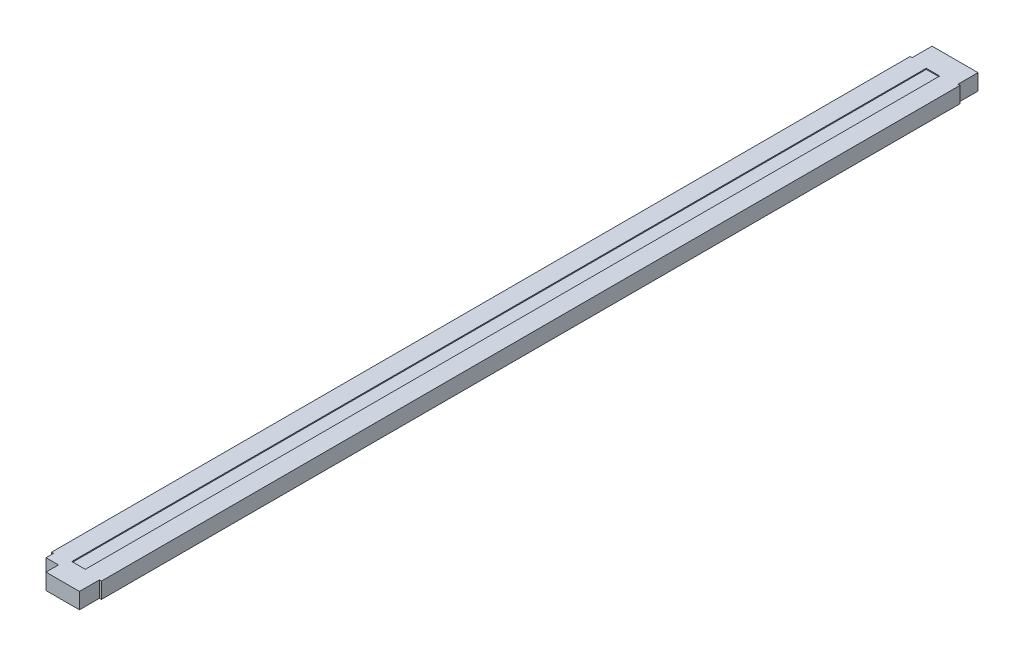
ISO-10303-21;
HEADER;
FILE_DESCRIPTION(('STEP AP214'),'2;1');
FILE_NAME('part.step','',(''),(''),'','','');
FILE_SCHEMA(('AUTOMOTIVE_DESIGN { 1 0 10303 214 1 1 1 1 }'));
ENDSEC;
DATA;
#1=APPLICATION_CONTEXT('core data for automotive mechanical design processes');
#2=APPLICATION_PROTOCOL_DEFINITION('international standard','automotive_design',2000,#1);
#3=PRODUCT_CONTEXT('',#1,'mechanical');
#4=PRODUCT('Part','Part','',(#3));
#5=PRODUCT_RELATED_PRODUCT_CATEGORY('part','',(#4));
#6=PRODUCT_DEFINITION_FORMATION('','',#4);
#7=PRODUCT_DEFINITION_CONTEXT('part definition',#1,'design');
#8=PRODUCT_DEFINITION('design','',#6,#7);
#9=PRODUCT_DEFINITION_SHAPE('','',#8);
#10=(LENGTH_UNIT() NAMED_UNIT(*) SI_UNIT(.MILLI.,.METRE.));
#11=(NAMED_UNIT(*) PLANE_ANGLE_UNIT() SI_UNIT($,.RADIAN.));
#12=(NAMED_UNIT(*) SI_UNIT($,.STERADIAN.) SOLID_ANGLE_UNIT());
#13=UNCERTAINTY_MEASURE_WITH_UNIT(LENGTH_MEASURE(1.E-05),#10,'distance_accuracy_value','');
#14=(GEOMETRIC_REPRESENTATION_CONTEXT(3) GLOBAL_UNCERTAINTY_ASSIGNED_CONTEXT((#13)) GLOBAL_UNIT_ASSIGNED_CONTEXT((#10,
#11,#12)) REPRESENTATION_CONTEXT('',''));
#15=CARTESIAN_POINT('',(0.,0.,0.));
#16=DIRECTION('',(0.,0.,1.));
#17=DIRECTION('',(1.,0.,0.));
#18=AXIS2_PLACEMENT_3D('',#15,#16,#17);
#19=CARTESIAN_POINT('',(-6.35,2.032,228.6));
#20=DIRECTION('',(0.,-1.,0.));
#21=DIRECTION('',(0.,0.,-1.));
#22=AXIS2_PLACEMENT_3D('',#19,#20,#21);
#23=PLANE('',#22);
#24=DIRECTION('',(1.,0.,0.));
#25=VECTOR('',#24,1.);
#26=CARTESIAN_POINT('',(-1.7145,2.032,222.9866));
#27=LINE('',#26,#25);
#28=CARTESIAN_POINT('',(-1.7145,2.032,222.9866));
#29=VERTEX_POINT('',#28);
#30=CARTESIAN_POINT('',(1.7145,2.032,222.9866));
#31=VERTEX_POINT('',#30);
#32=EDGE_CURVE('E264',#29,#31,#27,.T.);
#33=ORIENTED_EDGE('',*,*,#32,.F.);
#34=DIRECTION('',(0.,0.,1.));
#35=VECTOR('',#34,1.);
#36=CARTESIAN_POINT('',(-1.7145,2.032,5.6134));
#37=LINE('',#36,#35);
#38=CARTESIAN_POINT('',(-1.7145,2.032,5.6134));
#39=VERTEX_POINT('',#38);
#40=EDGE_CURVE('E246',#39,#29,#37,.T.);
#41=ORIENTED_EDGE('',*,*,#40,.F.);
#42=DIRECTION('',(-1.,0.,0.));
#43=VECTOR('',#42,1.);
#44=CARTESIAN_POINT('',(-1.7145,2.032,5.6134));
#45=LINE('',#44,#43);
#46=CARTESIAN_POINT('',(1.7145,2.032,5.61339999999999));
#47=VERTEX_POINT('',#46);
#48=EDGE_CURVE('E253',#47,#39,#45,.T.);
#49=ORIENTED_EDGE('',*,*,#48,.F.);
#50=DIRECTION('',(0.,0.,-1.));
#51=VECTOR('',#50,1.);
#52=CARTESIAN_POINT('',(1.7145,2.032,5.61339999999999));
#53=LINE('',#52,#51);
#54=EDGE_CURVE('E267',#31,#47,#53,.T.);
#55=ORIENTED_EDGE('',*,*,#54,.F.);
#56=EDGE_LOOP('',(#33,#41,#49,#55));
#57=FACE_BOUND('',#56,.T.);
#58=DIRECTION('',(0.,0.,-1.));
#59=VECTOR('',#58,1.);
#60=CARTESIAN_POINT('',(-5.84199999999999,2.032,228.6));
#61=LINE('',#60,#59);
#62=CARTESIAN_POINT('',(-5.84199999999999,2.032,225.425));
#63=VERTEX_POINT('',#62);
#64=CARTESIAN_POINT('',(-5.84199999999999,2.032,223.52));
#65=VERTEX_POINT('',#64);
#66=EDGE_CURVE('E233',#63,#65,#61,.T.);
#67=ORIENTED_EDGE('',*,*,#66,.F.);
#68=DIRECTION('',(-1.,0.,0.));
#69=VECTOR('',#68,1.);
#70=CARTESIAN_POINT('',(-5.84199999999999,2.032,225.425));
#71=LINE('',#70,#69);
#72=CARTESIAN_POINT('',(-2.66699999999999,2.032,225.425));
#73=VERTEX_POINT('',#72);
#74=EDGE_CURVE('E49',#73,#63,#71,.T.);
#75=ORIENTED_EDGE('',*,*,#74,.F.);
#76=DIRECTION('',(0.,0.,-1.));
#77=VECTOR('',#76,1.);
#78=CARTESIAN_POINT('',(-2.66699999999999,2.032,228.6));
#79=LINE('',#78,#77);
#80=CARTESIAN_POINT('',(-2.66699999999999,2.032,228.6));
#81=VERTEX_POINT('',#80);
#82=EDGE_CURVE('E519',#81,#73,#79,.T.);
#83=ORIENTED_EDGE('',*,*,#82,.F.);
#84=DIRECTION('',(-1.,0.,0.));
#85=VECTOR('',#84,1.);
#86=CARTESIAN_POINT('',(-6.35,2.032,228.6));
#87=LINE('',#86,#85);
#88=CARTESIAN_POINT('',(5.84199999999999,2.032,228.6));
#89=VERTEX_POINT('',#88);
#90=EDGE_CURVE('E178',#89,#81,#87,.T.);
#91=ORIENTED_EDGE('',*,*,#90,.F.);
#92=DIRECTION('',(0.,0.,-1.));
#93=VECTOR('',#92,1.);
#94=CARTESIAN_POINT('',(5.84199999999999,2.032,228.6));
#95=LINE('',#94,#93);
#96=CARTESIAN_POINT('',(5.84199999999999,2.032,223.52));
#97=VERTEX_POINT('',#96);
#98=EDGE_CURVE('E506',#89,#97,#95,.T.);
#99=ORIENTED_EDGE('',*,*,#98,.T.);
#100=DIRECTION('',(1.,0.,0.));
#101=VECTOR('',#100,1.);
#102=CARTESIAN_POINT('',(6.34999999999999,2.032,223.52));
#103=LINE('',#102,#101);
#104=CARTESIAN_POINT('',(6.34999999999999,2.032,223.52));
#105=VERTEX_POINT('',#104);
#106=EDGE_CURVE('E503',#97,#105,#103,.T.);
#107=ORIENTED_EDGE('',*,*,#106,.T.);
#108=DIRECTION('',(0.,0.,-1.));
#109=VECTOR('',#108,1.);
#110=CARTESIAN_POINT('',(6.35,2.032,228.6));
#111=LINE('',#110,#109);
#112=CARTESIAN_POINT('',(6.34999999999999,2.032,5.08));
#113=VERTEX_POINT('',#112);
#114=EDGE_CURVE('E11',#105,#113,#111,.T.);
#115=ORIENTED_EDGE('',*,*,#114,.T.);
#116=DIRECTION('',(1.,0.,0.));
#117=VECTOR('',#116,1.);
#118=CARTESIAN_POINT('',(6.34999999999999,2.032,5.08));
#119=LINE('',#118,#117);
#120=CARTESIAN_POINT('',(5.84199999999999,2.032,5.08));
#121=VERTEX_POINT('',#120);
#122=EDGE_CURVE('E494',#121,#113,#119,.T.);
#123=ORIENTED_EDGE('',*,*,#122,.F.);
#124=DIRECTION('',(0.,0.,1.));
#125=VECTOR('',#124,1.);
#126=CARTESIAN_POINT('',(5.84199999999999,2.032,0.));
#127=LINE('',#126,#125);
#128=CARTESIAN_POINT('',(5.84199999999999,2.032,0.));
#129=VERTEX_POINT('',#128);
#130=EDGE_CURVE('E497',#129,#121,#127,.T.);
#131=ORIENTED_EDGE('',*,*,#130,.F.);
#132=DIRECTION('',(-1.,0.,0.));
#133=VECTOR('',#132,1.);
#134=CARTESIAN_POINT('',(-6.35,2.032,0.));
#135=LINE('',#134,#133);
#136=CARTESIAN_POINT('',(-5.84199999999999,2.032,0.));
#137=VERTEX_POINT('',#136);
#138=EDGE_CURVE('E193',#129,#137,#135,.T.);
#139=ORIENTED_EDGE('',*,*,#138,.T.);
#140=DIRECTION('',(0.,0.,1.));
#141=VECTOR('',#140,1.);
#142=CARTESIAN_POINT('',(-5.84199999999999,2.032,0.));
#143=LINE('',#142,#141);
#144=CARTESIAN_POINT('',(-5.84199999999999,2.032,5.08));
#145=VERTEX_POINT('',#144);
#146=EDGE_CURVE('E217',#137,#145,#143,.T.);
#147=ORIENTED_EDGE('',*,*,#146,.T.);
#148=DIRECTION('',(-1.,0.,0.));
#149=VECTOR('',#148,1.);
#150=CARTESIAN_POINT('',(-6.34999999999999,2.032,5.08));
#151=LINE('',#150,#149);
#152=CARTESIAN_POINT('',(-6.34999999999999,2.032,5.08));
#153=VERTEX_POINT('',#152);
#154=EDGE_CURVE('E215',#145,#153,#151,.T.);
#155=ORIENTED_EDGE('',*,*,#154,.T.);
#156=DIRECTION('',(0.,0.,-1.));
#157=VECTOR('',#156,1.);
#158=CARTESIAN_POINT('',(-6.35,2.032,228.6));
#159=LINE('',#158,#157);
#160=CARTESIAN_POINT('',(-6.34999999999999,2.032,223.52));
#161=VERTEX_POINT('',#160);
#162=EDGE_CURVE('E42',#161,#153,#159,.T.);
#163=ORIENTED_EDGE('',*,*,#162,.F.);
#164=DIRECTION('',(-1.,0.,0.));
#165=VECTOR('',#164,1.);
#166=CARTESIAN_POINT('',(-6.34999999999999,2.032,223.52));
#167=LINE('',#166,#165);
#168=EDGE_CURVE('E212',#65,#161,#167,.T.);
#169=ORIENTED_EDGE('',*,*,#168,.F.);
#170=EDGE_LOOP('',(#67,#75,#83,#91,#99,#107,#115,#123,#131,#139,#147,#155,#163,#169));
#171=FACE_BOUND('',#170,.T.);
#172=ADVANCED_FACE('F34',(#57,#171),#23,.F.);
#173=CARTESIAN_POINT('',(-6.35,-2.032,228.6));
#174=DIRECTION('',(0.,1.,0.));
#175=DIRECTION('',(0.,0.,1.));
#176=AXIS2_PLACEMENT_3D('',#173,#174,#175);
#177=PLANE('',#176);
#178=DIRECTION('',(0.,0.,-1.));
#179=VECTOR('',#178,1.);
#180=CARTESIAN_POINT('',(-2.66699999999999,-2.032,228.6));
#181=LINE('',#180,#179);
#182=CARTESIAN_POINT('',(-2.66699999999999,-2.032,228.6));
#183=VERTEX_POINT('',#182);
#184=CARTESIAN_POINT('',(-2.66699999999999,-2.032,225.425));
#185=VERTEX_POINT('',#184);
#186=EDGE_CURVE('E158',#183,#185,#181,.T.);
#187=ORIENTED_EDGE('',*,*,#186,.T.);
#188=DIRECTION('',(-1.,0.,0.));
#189=VECTOR('',#188,1.);
#190=CARTESIAN_POINT('',(-5.84199999999999,-2.032,225.425));
#191=LINE('',#190,#189);
#192=CARTESIAN_POINT('',(-5.84199999999999,-2.032,225.425));
#193=VERTEX_POINT('',#192);
#194=EDGE_CURVE('E169',#185,#193,#191,.T.);
#195=ORIENTED_EDGE('',*,*,#194,.T.);
#196=DIRECTION('',(0.,0.,-1.));
#197=VECTOR('',#196,1.);
#198=CARTESIAN_POINT('',(-5.84199999999999,-2.032,228.6));
#199=LINE('',#198,#197);
#200=CARTESIAN_POINT('',(-5.84199999999999,-2.032,223.52));
#201=VERTEX_POINT('',#200);
#202=EDGE_CURVE('E237',#193,#201,#199,.T.);
#203=ORIENTED_EDGE('',*,*,#202,.T.);
#204=DIRECTION('',(-1.,0.,0.));
#205=VECTOR('',#204,1.);
#206=CARTESIAN_POINT('',(-6.34999999999999,-2.032,223.52));
#207=LINE('',#206,#205);
#208=CARTESIAN_POINT('',(-6.34999999999999,-2.032,223.52));
#209=VERTEX_POINT('',#208);
#210=EDGE_CURVE('E239',#201,#209,#207,.T.);
#211=ORIENTED_EDGE('',*,*,#210,.T.);
#212=DIRECTION('',(0.,0.,-1.));
#213=VECTOR('',#212,1.);
#214=CARTESIAN_POINT('',(-6.35,-2.032,228.6));
#215=LINE('',#214,#213);
#216=CARTESIAN_POINT('',(-6.34999999999999,-2.032,5.08));
#217=VERTEX_POINT('',#216);
#218=EDGE_CURVE('E187',#209,#217,#215,.T.);
#219=ORIENTED_EDGE('',*,*,#218,.T.);
#220=DIRECTION('',(-1.,0.,0.));
#221=VECTOR('',#220,1.);
#222=CARTESIAN_POINT('',(-6.34999999999999,-2.032,5.08));
#223=LINE('',#222,#221);
#224=CARTESIAN_POINT('',(-5.84199999999999,-2.032,5.08));
#225=VERTEX_POINT('',#224);
#226=EDGE_CURVE('E222',#225,#217,#223,.T.);
#227=ORIENTED_EDGE('',*,*,#226,.F.);
#228=DIRECTION('',(0.,0.,1.));
#229=VECTOR('',#228,1.);
#230=CARTESIAN_POINT('',(-5.84199999999999,-2.032,0.));
#231=LINE('',#230,#229);
#232=CARTESIAN_POINT('',(-5.84199999999999,-2.032,0.));
#233=VERTEX_POINT('',#232);
#234=EDGE_CURVE('E227',#233,#225,#231,.T.);
#235=ORIENTED_EDGE('',*,*,#234,.F.);
#236=DIRECTION('',(1.,0.,0.));
#237=VECTOR('',#236,1.);
#238=CARTESIAN_POINT('',(-6.35,-2.032,0.));
#239=LINE('',#238,#237);
#240=CARTESIAN_POINT('',(5.84199999999999,-2.032,0.));
#241=VERTEX_POINT('',#240);
#242=EDGE_CURVE('E189',#233,#241,#239,.T.);
#243=ORIENTED_EDGE('',*,*,#242,.T.);
#244=DIRECTION('',(0.,0.,1.));
#245=VECTOR('',#244,1.);
#246=CARTESIAN_POINT('',(5.84199999999999,-2.032,0.));
#247=LINE('',#246,#245);
#248=CARTESIAN_POINT('',(5.84199999999999,-2.032,5.08));
#249=VERTEX_POINT('',#248);
#250=EDGE_CURVE('E57',#241,#249,#247,.T.);
#251=ORIENTED_EDGE('',*,*,#250,.T.);
#252=DIRECTION('',(1.,0.,0.));
#253=VECTOR('',#252,1.);
#254=CARTESIAN_POINT('',(6.34999999999999,-2.032,5.08));
#255=LINE('',#254,#253);
#256=CARTESIAN_POINT('',(6.34999999999999,-2.032,5.08));
#257=VERTEX_POINT('',#256);
#258=EDGE_CURVE('E489',#249,#257,#255,.T.);
#259=ORIENTED_EDGE('',*,*,#258,.T.);
#260=DIRECTION('',(0.,0.,-1.));
#261=VECTOR('',#260,1.);
#262=CARTESIAN_POINT('',(6.35,-2.032,228.6));
#263=LINE('',#262,#261);
#264=CARTESIAN_POINT('',(6.34999999999999,-2.032,223.52));
#265=VERTEX_POINT('',#264);
#266=EDGE_CURVE('E184',#265,#257,#263,.T.);
#267=ORIENTED_EDGE('',*,*,#266,.F.);
#268=DIRECTION('',(1.,0.,0.));
#269=VECTOR('',#268,1.);
#270=CARTESIAN_POINT('',(6.34999999999999,-2.032,223.52));
#271=LINE('',#270,#269);
#272=CARTESIAN_POINT('',(5.84199999999999,-2.032,223.52));
#273=VERTEX_POINT('',#272);
#274=EDGE_CURVE('E487',#273,#265,#271,.T.);
#275=ORIENTED_EDGE('',*,*,#274,.F.);
#276=DIRECTION('',(0.,0.,-1.));
#277=VECTOR('',#276,1.);
#278=CARTESIAN_POINT('',(5.84199999999999,-2.032,228.6));
#279=LINE('',#278,#277);
#280=CARTESIAN_POINT('',(5.84199999999999,-2.032,228.6));
#281=VERTEX_POINT('',#280);
#282=EDGE_CURVE('E183',#281,#273,#279,.T.);
#283=ORIENTED_EDGE('',*,*,#282,.F.);
#284=DIRECTION('',(1.,0.,0.));
#285=VECTOR('',#284,1.);
#286=CARTESIAN_POINT('',(-6.35,-2.032,228.6));
#287=LINE('',#286,#285);
#288=EDGE_CURVE('E175',#183,#281,#287,.T.);
#289=ORIENTED_EDGE('',*,*,#288,.F.);
#290=EDGE_LOOP('',(#187,#195,#203,#211,#219,#227,#235,#243,#251,#259,#267,#275,#283,#289));
#291=FACE_BOUND('',#290,.T.);
#292=ADVANCED_FACE('F181',(#291),#177,.F.);
#293=CARTESIAN_POINT('',(6.35,-2.032,228.6));
#294=DIRECTION('',(-1.,0.,0.));
#295=DIRECTION('',(0.,0.,1.));
#296=AXIS2_PLACEMENT_3D('',#293,#294,#295);
#297=PLANE('',#296);
#298=ORIENTED_EDGE('',*,*,#266,.T.);
#299=DIRECTION('',(0.,1.,0.));
#300=VECTOR('',#299,1.);
#301=CARTESIAN_POINT('',(6.34999999999999,-2.032,5.08));
#302=LINE('',#301,#300);
#303=EDGE_CURVE('E484',#257,#113,#302,.T.);
#304=ORIENTED_EDGE('',*,*,#303,.T.);
#305=ORIENTED_EDGE('',*,*,#114,.F.);
#306=DIRECTION('',(0.,1.,0.));
#307=VECTOR('',#306,1.);
#308=CARTESIAN_POINT('',(6.34999999999999,-2.032,223.52));
#309=LINE('',#308,#307);
#310=EDGE_CURVE('E485',#265,#105,#309,.T.);
#311=ORIENTED_EDGE('',*,*,#310,.F.);
#312=EDGE_LOOP('',(#298,#304,#305,#311));
#313=FACE_BOUND('',#312,.T.);
#314=ADVANCED_FACE('F36',(#313),#297,.F.);
#315=CARTESIAN_POINT('',(0.,0.,228.6));
#316=DIRECTION('',(0.,0.,-1.));
#317=DIRECTION('',(-1.,0.,0.));
#318=AXIS2_PLACEMENT_3D('',#315,#316,#317);
#319=PLANE('',#318);
#320=ORIENTED_EDGE('',*,*,#90,.T.);
#321=DIRECTION('',(0.,1.,0.));
#322=VECTOR('',#321,1.);
#323=CARTESIAN_POINT('',(-2.66699999999999,-2.032,228.6));
#324=LINE('',#323,#322);
#325=EDGE_CURVE('E162',#183,#81,#324,.T.);
#326=ORIENTED_EDGE('',*,*,#325,.F.);
#327=ORIENTED_EDGE('',*,*,#288,.T.);
#328=DIRECTION('',(0.,1.,0.));
#329=VECTOR('',#328,1.);
#330=CARTESIAN_POINT('',(5.84199999999999,-2.032,228.6));
#331=LINE('',#330,#329);
#332=EDGE_CURVE('E220',#281,#89,#331,.T.);
#333=ORIENTED_EDGE('',*,*,#332,.T.);
#334=EDGE_LOOP('',(#320,#326,#327,#333));
#335=FACE_BOUND('',#334,.T.);
#336=ADVANCED_FACE('F173',(#335),#319,.F.);
#337=CARTESIAN_POINT('',(-6.35,-2.032,228.6));
#338=DIRECTION('',(1.,0.,0.));
#339=DIRECTION('',(0.,0.,-1.));
#340=AXIS2_PLACEMENT_3D('',#337,#338,#339);
#341=PLANE('',#340);
#342=DIRECTION('',(0.,1.,0.));
#343=VECTOR('',#342,1.);
#344=CARTESIAN_POINT('',(-6.34999999999999,-2.032,5.08));
#345=LINE('',#344,#343);
#346=EDGE_CURVE('E206',#217,#153,#345,.T.);
#347=ORIENTED_EDGE('',*,*,#346,.F.);
#348=ORIENTED_EDGE('',*,*,#218,.F.);
#349=DIRECTION('',(0.,1.,0.));
#350=VECTOR('',#349,1.);
#351=CARTESIAN_POINT('',(-6.34999999999999,-2.032,223.52));
#352=LINE('',#351,#350);
#353=EDGE_CURVE('E207',#209,#161,#352,.T.);
#354=ORIENTED_EDGE('',*,*,#353,.T.);
#355=ORIENTED_EDGE('',*,*,#162,.T.);
#356=EDGE_LOOP('',(#347,#348,#354,#355));
#357=FACE_BOUND('',#356,.T.);
#358=ADVANCED_FACE('F204',(#357),#341,.F.);
#359=CARTESIAN_POINT('',(0.,0.,0.));
#360=DIRECTION('',(0.,0.,-1.));
#361=DIRECTION('',(-1.,0.,0.));
#362=AXIS2_PLACEMENT_3D('',#359,#360,#361);
#363=PLANE('',#362);
#364=DIRECTION('',(0.,1.,0.));
#365=VECTOR('',#364,1.);
#366=CARTESIAN_POINT('',(5.84199999999999,-2.032,0.));
#367=LINE('',#366,#365);
#368=EDGE_CURVE('E490',#241,#129,#367,.T.);
#369=ORIENTED_EDGE('',*,*,#368,.F.);
#370=ORIENTED_EDGE('',*,*,#242,.F.);
#371=DIRECTION('',(0.,1.,0.));
#372=VECTOR('',#371,1.);
#373=CARTESIAN_POINT('',(-5.84199999999999,-2.032,0.));
#374=LINE('',#373,#372);
#375=EDGE_CURVE('E230',#233,#137,#374,.T.);
#376=ORIENTED_EDGE('',*,*,#375,.T.);
#377=ORIENTED_EDGE('',*,*,#138,.F.);
#378=EDGE_LOOP('',(#369,#370,#376,#377));
#379=FACE_BOUND('',#378,.T.);
#380=ADVANCED_FACE('F303',(#379),#363,.T.);
#381=CARTESIAN_POINT('',(-1.7145,1.778,5.6134));
#382=DIRECTION('',(-1.,0.,0.));
#383=DIRECTION('',(0.,0.,1.));
#384=AXIS2_PLACEMENT_3D('',#381,#382,#383);
#385=PLANE('',#384);
#386=ORIENTED_EDGE('',*,*,#40,.T.);
#387=DIRECTION('',(0.,1.,0.));
#388=VECTOR('',#387,1.);
#389=CARTESIAN_POINT('',(-1.7145,1.778,222.9866));
#390=LINE('',#389,#388);
#391=CARTESIAN_POINT('',(-1.7145,1.778,222.9866));
#392=VERTEX_POINT('',#391);
#393=EDGE_CURVE('E262',#392,#29,#390,.T.);
#394=ORIENTED_EDGE('',*,*,#393,.F.);
#395=DIRECTION('',(0.,0.,1.));
#396=VECTOR('',#395,1.);
#397=CARTESIAN_POINT('',(-1.7145,1.778,5.6134));
#398=LINE('',#397,#396);
#399=CARTESIAN_POINT('',(-1.7145,1.778,5.6134));
#400=VERTEX_POINT('',#399);
#401=EDGE_CURVE('E249',#400,#392,#398,.T.);
#402=ORIENTED_EDGE('',*,*,#401,.F.);
#403=DIRECTION('',(0.,1.,0.));
#404=VECTOR('',#403,1.);
#405=CARTESIAN_POINT('',(-1.7145,1.778,5.6134));
#406=LINE('',#405,#404);
#407=EDGE_CURVE('E195',#400,#39,#406,.T.);
#408=ORIENTED_EDGE('',*,*,#407,.T.);
#409=EDGE_LOOP('',(#386,#394,#402,#408));
#410=FACE_BOUND('',#409,.T.);
#411=ADVANCED_FACE('F293',(#410),#385,.F.);
#412=CARTESIAN_POINT('',(-1.7145,1.778,5.6134));
#413=DIRECTION('',(0.,0.,-1.));
#414=DIRECTION('',(-1.,0.,0.));
#415=AXIS2_PLACEMENT_3D('',#412,#413,#414);
#416=PLANE('',#415);
#417=ORIENTED_EDGE('',*,*,#48,.T.);
#418=ORIENTED_EDGE('',*,*,#407,.F.);
#419=DIRECTION('',(-1.,0.,0.));
#420=VECTOR('',#419,1.);
#421=CARTESIAN_POINT('',(-1.7145,1.778,5.6134));
#422=LINE('',#421,#420);
#423=CARTESIAN_POINT('',(1.7145,1.778,5.61339999999999));
#424=VERTEX_POINT('',#423);
#425=EDGE_CURVE('E259',#424,#400,#422,.T.);
#426=ORIENTED_EDGE('',*,*,#425,.F.);
#427=DIRECTION('',(0.,1.,0.));
#428=VECTOR('',#427,1.);
#429=CARTESIAN_POINT('',(1.7145,1.778,5.61339999999999));
#430=LINE('',#429,#428);
#431=EDGE_CURVE('E273',#424,#47,#430,.T.);
#432=ORIENTED_EDGE('',*,*,#431,.T.);
#433=EDGE_LOOP('',(#417,#418,#426,#432));
#434=FACE_BOUND('',#433,.T.);
#435=ADVANCED_FACE('F295',(#434),#416,.F.);
#436=CARTESIAN_POINT('',(1.7145,1.778,5.61339999999999));
#437=DIRECTION('',(1.,0.,0.));
#438=DIRECTION('',(0.,0.,-1.));
#439=AXIS2_PLACEMENT_3D('',#436,#437,#438);
#440=PLANE('',#439);
#441=ORIENTED_EDGE('',*,*,#54,.T.);
#442=ORIENTED_EDGE('',*,*,#431,.F.);
#443=DIRECTION('',(0.,0.,-1.));
#444=VECTOR('',#443,1.);
#445=CARTESIAN_POINT('',(1.7145,1.778,5.61339999999999));
#446=LINE('',#445,#444);
#447=CARTESIAN_POINT('',(1.7145,1.778,222.9866));
#448=VERTEX_POINT('',#447);
#449=EDGE_CURVE('E256',#448,#424,#446,.T.);
#450=ORIENTED_EDGE('',*,*,#449,.F.);
#451=DIRECTION('',(0.,1.,0.));
#452=VECTOR('',#451,1.);
#453=CARTESIAN_POINT('',(1.7145,1.778,222.9866));
#454=LINE('',#453,#452);
#455=EDGE_CURVE('E275',#448,#31,#454,.T.);
#456=ORIENTED_EDGE('',*,*,#455,.T.);
#457=EDGE_LOOP('',(#441,#442,#450,#456));
#458=FACE_BOUND('',#457,.T.);
#459=ADVANCED_FACE('F288',(#458),#440,.F.);
#460=CARTESIAN_POINT('',(-1.7145,1.778,222.9866));
#461=DIRECTION('',(0.,0.,1.));
#462=DIRECTION('',(1.,0.,0.));
#463=AXIS2_PLACEMENT_3D('',#460,#461,#462);
#464=PLANE('',#463);
#465=ORIENTED_EDGE('',*,*,#32,.T.);
#466=ORIENTED_EDGE('',*,*,#455,.F.);
#467=DIRECTION('',(1.,0.,0.));
#468=VECTOR('',#467,1.);
#469=CARTESIAN_POINT('',(-1.7145,1.778,222.9866));
#470=LINE('',#469,#468);
#471=EDGE_CURVE('E252',#392,#448,#470,.T.);
#472=ORIENTED_EDGE('',*,*,#471,.F.);
#473=ORIENTED_EDGE('',*,*,#393,.T.);
#474=EDGE_LOOP('',(#465,#466,#472,#473));
#475=FACE_BOUND('',#474,.T.);
#476=ADVANCED_FACE('F280',(#475),#464,.F.);
#477=CARTESIAN_POINT('',(0.,1.778,0.));
#478=DIRECTION('',(0.,1.,0.));
#479=DIRECTION('',(0.,0.,1.));
#480=AXIS2_PLACEMENT_3D('',#477,#478,#479);
#481=PLANE('',#480);
#482=ORIENTED_EDGE('',*,*,#401,.T.);
#483=ORIENTED_EDGE('',*,*,#471,.T.);
#484=ORIENTED_EDGE('',*,*,#449,.T.);
#485=ORIENTED_EDGE('',*,*,#425,.T.);
#486=EDGE_LOOP('',(#482,#483,#484,#485));
#487=FACE_BOUND('',#486,.T.);
#488=ADVANCED_FACE('F292',(#487),#481,.T.);
#489=CARTESIAN_POINT('',(-6.34999999999999,-2.032,223.52));
#490=DIRECTION('',(0.,0.,-1.));
#491=DIRECTION('',(-1.,0.,0.));
#492=AXIS2_PLACEMENT_3D('',#489,#490,#491);
#493=PLANE('',#492);
#494=ORIENTED_EDGE('',*,*,#168,.T.);
#495=ORIENTED_EDGE('',*,*,#353,.F.);
#496=ORIENTED_EDGE('',*,*,#210,.F.);
#497=DIRECTION('',(0.,1.,0.));
#498=VECTOR('',#497,1.);
#499=CARTESIAN_POINT('',(-5.84199999999999,-2.032,223.52));
#500=LINE('',#499,#498);
#501=EDGE_CURVE('E242',#201,#65,#500,.T.);
#502=ORIENTED_EDGE('',*,*,#501,.T.);
#503=EDGE_LOOP('',(#494,#495,#496,#502));
#504=FACE_BOUND('',#503,.T.);
#505=ADVANCED_FACE('F324',(#504),#493,.F.);
#506=CARTESIAN_POINT('',(-5.84199999999999,-2.032,228.6));
#507=DIRECTION('',(1.,0.,0.));
#508=DIRECTION('',(0.,0.,-1.));
#509=AXIS2_PLACEMENT_3D('',#506,#507,#508);
#510=PLANE('',#509);
#511=ORIENTED_EDGE('',*,*,#202,.F.);
#512=DIRECTION('',(0.,1.,0.));
#513=VECTOR('',#512,1.);
#514=CARTESIAN_POINT('',(-5.84199999999999,-2.032,225.425));
#515=LINE('',#514,#513);
#516=EDGE_CURVE('E500',#193,#63,#515,.T.);
#517=ORIENTED_EDGE('',*,*,#516,.T.);
#518=ORIENTED_EDGE('',*,*,#66,.T.);
#519=ORIENTED_EDGE('',*,*,#501,.F.);
#520=EDGE_LOOP('',(#511,#517,#518,#519));
#521=FACE_BOUND('',#520,.T.);
#522=ADVANCED_FACE('F328',(#521),#510,.F.);
#523=CARTESIAN_POINT('',(-5.84199999999999,-2.032,0.));
#524=DIRECTION('',(-1.,0.,0.));
#525=DIRECTION('',(0.,0.,1.));
#526=AXIS2_PLACEMENT_3D('',#523,#524,#525);
#527=PLANE('',#526);
#528=ORIENTED_EDGE('',*,*,#146,.F.);
#529=ORIENTED_EDGE('',*,*,#375,.F.);
#530=ORIENTED_EDGE('',*,*,#234,.T.);
#531=DIRECTION('',(0.,1.,0.));
#532=VECTOR('',#531,1.);
#533=CARTESIAN_POINT('',(-5.84199999999999,-2.032,5.08));
#534=LINE('',#533,#532);
#535=EDGE_CURVE('E234',#225,#145,#534,.T.);
#536=ORIENTED_EDGE('',*,*,#535,.T.);
#537=EDGE_LOOP('',(#528,#529,#530,#536));
#538=FACE_BOUND('',#537,.T.);
#539=ADVANCED_FACE('F333',(#538),#527,.T.);
#540=CARTESIAN_POINT('',(-6.34999999999999,-2.032,5.08));
#541=DIRECTION('',(0.,0.,-1.));
#542=DIRECTION('',(-1.,0.,0.));
#543=AXIS2_PLACEMENT_3D('',#540,#541,#542);
#544=PLANE('',#543);
#545=ORIENTED_EDGE('',*,*,#154,.F.);
#546=ORIENTED_EDGE('',*,*,#535,.F.);
#547=ORIENTED_EDGE('',*,*,#226,.T.);
#548=ORIENTED_EDGE('',*,*,#346,.T.);
#549=EDGE_LOOP('',(#545,#546,#547,#548));
#550=FACE_BOUND('',#549,.T.);
#551=ADVANCED_FACE('F336',(#550),#544,.T.);
#552=CARTESIAN_POINT('',(5.84199999999999,-2.032,228.6));
#553=DIRECTION('',(1.,0.,0.));
#554=DIRECTION('',(0.,0.,-1.));
#555=AXIS2_PLACEMENT_3D('',#552,#553,#554);
#556=PLANE('',#555);
#557=ORIENTED_EDGE('',*,*,#98,.F.);
#558=ORIENTED_EDGE('',*,*,#332,.F.);
#559=ORIENTED_EDGE('',*,*,#282,.T.);
#560=DIRECTION('',(0.,1.,0.));
#561=VECTOR('',#560,1.);
#562=CARTESIAN_POINT('',(5.84199999999999,-2.032,223.52));
#563=LINE('',#562,#561);
#564=EDGE_CURVE('E224',#273,#97,#563,.T.);
#565=ORIENTED_EDGE('',*,*,#564,.T.);
#566=EDGE_LOOP('',(#557,#558,#559,#565));
#567=FACE_BOUND('',#566,.T.);
#568=ADVANCED_FACE('F339',(#567),#556,.T.);
#569=CARTESIAN_POINT('',(6.34999999999999,-2.032,223.52));
#570=DIRECTION('',(0.,0.,1.));
#571=DIRECTION('',(1.,0.,0.));
#572=AXIS2_PLACEMENT_3D('',#569,#570,#571);
#573=PLANE('',#572);
#574=ORIENTED_EDGE('',*,*,#106,.F.);
#575=ORIENTED_EDGE('',*,*,#564,.F.);
#576=ORIENTED_EDGE('',*,*,#274,.T.);
#577=ORIENTED_EDGE('',*,*,#310,.T.);
#578=EDGE_LOOP('',(#574,#575,#576,#577));
#579=FACE_BOUND('',#578,.T.);
#580=ADVANCED_FACE('F343',(#579),#573,.T.);
#581=CARTESIAN_POINT('',(6.34999999999999,-2.032,5.08));
#582=DIRECTION('',(0.,0.,1.));
#583=DIRECTION('',(1.,0.,0.));
#584=AXIS2_PLACEMENT_3D('',#581,#582,#583);
#585=PLANE('',#584);
#586=ORIENTED_EDGE('',*,*,#122,.T.);
#587=ORIENTED_EDGE('',*,*,#303,.F.);
#588=ORIENTED_EDGE('',*,*,#258,.F.);
#589=DIRECTION('',(0.,1.,0.));
#590=VECTOR('',#589,1.);
#591=CARTESIAN_POINT('',(5.84199999999999,-2.032,5.08));
#592=LINE('',#591,#590);
#593=EDGE_CURVE('E492',#249,#121,#592,.T.);
#594=ORIENTED_EDGE('',*,*,#593,.T.);
#595=EDGE_LOOP('',(#586,#587,#588,#594));
#596=FACE_BOUND('',#595,.T.);
#597=ADVANCED_FACE('F346',(#596),#585,.F.);
#598=CARTESIAN_POINT('',(5.84199999999999,-2.032,0.));
#599=DIRECTION('',(-1.,0.,0.));
#600=DIRECTION('',(0.,0.,1.));
#601=AXIS2_PLACEMENT_3D('',#598,#599,#600);
#602=PLANE('',#601);
#603=ORIENTED_EDGE('',*,*,#130,.T.);
#604=ORIENTED_EDGE('',*,*,#593,.F.);
#605=ORIENTED_EDGE('',*,*,#250,.F.);
#606=ORIENTED_EDGE('',*,*,#368,.T.);
#607=EDGE_LOOP('',(#603,#604,#605,#606));
#608=FACE_BOUND('',#607,.T.);
#609=ADVANCED_FACE('F351',(#608),#602,.F.);
#610=CARTESIAN_POINT('',(-5.84199999999999,-2.032,225.425));
#611=DIRECTION('',(0.,0.,-1.));
#612=DIRECTION('',(-1.,0.,0.));
#613=AXIS2_PLACEMENT_3D('',#610,#611,#612);
#614=PLANE('',#613);
#615=ORIENTED_EDGE('',*,*,#74,.T.);
#616=ORIENTED_EDGE('',*,*,#516,.F.);
#617=ORIENTED_EDGE('',*,*,#194,.F.);
#618=DIRECTION('',(0.,1.,0.));
#619=VECTOR('',#618,1.);
#620=CARTESIAN_POINT('',(-2.66699999999999,-2.032,225.425));
#621=LINE('',#620,#619);
#622=EDGE_CURVE('E164',#185,#73,#621,.T.);
#623=ORIENTED_EDGE('',*,*,#622,.T.);
#624=EDGE_LOOP('',(#615,#616,#617,#623));
#625=FACE_BOUND('',#624,.T.);
#626=ADVANCED_FACE('F354',(#625),#614,.F.);
#627=CARTESIAN_POINT('',(-2.66699999999999,-2.032,228.6));
#628=DIRECTION('',(1.,0.,0.));
#629=DIRECTION('',(0.,0.,-1.));
#630=AXIS2_PLACEMENT_3D('',#627,#628,#629);
#631=PLANE('',#630);
#632=ORIENTED_EDGE('',*,*,#82,.T.);
#633=ORIENTED_EDGE('',*,*,#622,.F.);
#634=ORIENTED_EDGE('',*,*,#186,.F.);
#635=ORIENTED_EDGE('',*,*,#325,.T.);
#636=EDGE_LOOP('',(#632,#633,#634,#635));
#637=FACE_BOUND('',#636,.T.);
#638=ADVANCED_FACE('F161',(#637),#631,.F.);
#639=CLOSED_SHELL('',(#172,#292,#314,#336,#358,#380,#411,#435,#459,#476,#488,#505,#522,#539,
#551,#568,#580,#597,#609,#626,#638));
#640=MANIFOLD_SOLID_BREP('B2',#639);
#641=ADVANCED_BREP_SHAPE_REPRESENTATION('',(#18,#640),#14);
#642=SHAPE_DEFINITION_REPRESENTATION(#9,#641);
ENDSEC;
END-ISO-10303-21;
